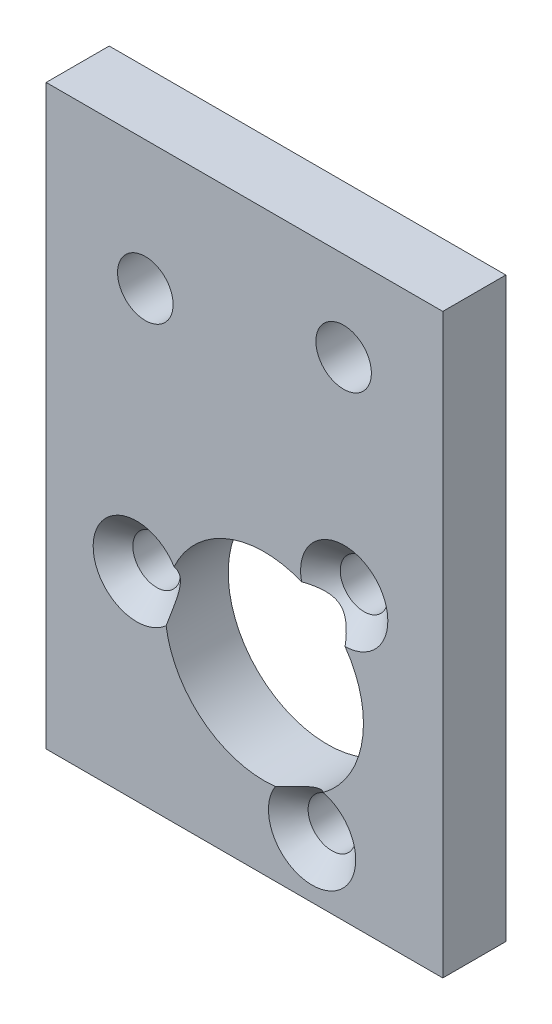
ISO-10303-21;
HEADER;
FILE_DESCRIPTION(('STEP AP214'),'2;1');
FILE_NAME('part.step','',(''),(''),'','','');
FILE_SCHEMA(('AUTOMOTIVE_DESIGN { 1 0 10303 214 1 1 1 1 }'));
ENDSEC;
DATA;
#1=APPLICATION_CONTEXT('core data for automotive mechanical design processes');
#2=APPLICATION_PROTOCOL_DEFINITION('international standard','automotive_design',2000,#1);
#3=PRODUCT_CONTEXT('',#1,'mechanical');
#4=PRODUCT('Part','Part','',(#3));
#5=PRODUCT_RELATED_PRODUCT_CATEGORY('part','',(#4));
#6=PRODUCT_DEFINITION_FORMATION('','',#4);
#7=PRODUCT_DEFINITION_CONTEXT('part definition',#1,'design');
#8=PRODUCT_DEFINITION('design','',#6,#7);
#9=PRODUCT_DEFINITION_SHAPE('','',#8);
#10=(LENGTH_UNIT() NAMED_UNIT(*) SI_UNIT(.MILLI.,.METRE.));
#11=(NAMED_UNIT(*) PLANE_ANGLE_UNIT() SI_UNIT($,.RADIAN.));
#12=(NAMED_UNIT(*) SI_UNIT($,.STERADIAN.) SOLID_ANGLE_UNIT());
#13=UNCERTAINTY_MEASURE_WITH_UNIT(LENGTH_MEASURE(1.E-05),#10,'distance_accuracy_value','');
#14=(GEOMETRIC_REPRESENTATION_CONTEXT(3) GLOBAL_UNCERTAINTY_ASSIGNED_CONTEXT((#13)) GLOBAL_UNIT_ASSIGNED_CONTEXT((#10,
#11,#12)) REPRESENTATION_CONTEXT('',''));
#15=CARTESIAN_POINT('',(0.,0.,0.));
#16=DIRECTION('',(0.,0.,1.));
#17=DIRECTION('',(1.,0.,0.));
#18=AXIS2_PLACEMENT_3D('',#15,#16,#17);
#19=CARTESIAN_POINT('',(0.,29.11,-3.18));
#20=DIRECTION('',(0.,-1.,0.));
#21=DIRECTION('',(0.,0.,-1.));
#22=AXIS2_PLACEMENT_3D('',#19,#20,#21);
#23=PLANE('',#22);
#24=DIRECTION('',(1.,0.,0.));
#25=VECTOR('',#24,1.);
#26=CARTESIAN_POINT('',(0.,29.11,0.));
#27=LINE('',#26,#25);
#28=CARTESIAN_POINT('',(0.,29.11,0.));
#29=VERTEX_POINT('',#28);
#30=CARTESIAN_POINT('',(20.,29.11,0.));
#31=VERTEX_POINT('',#30);
#32=EDGE_CURVE('E249',#29,#31,#27,.T.);
#33=ORIENTED_EDGE('',*,*,#32,.T.);
#34=DIRECTION('',(0.,0.,1.));
#35=VECTOR('',#34,1.);
#36=CARTESIAN_POINT('',(20.,29.11,-3.18));
#37=LINE('',#36,#35);
#38=CARTESIAN_POINT('',(20.,29.11,-3.18));
#39=VERTEX_POINT('',#38);
#40=EDGE_CURVE('E291',#39,#31,#37,.T.);
#41=ORIENTED_EDGE('',*,*,#40,.F.);
#42=DIRECTION('',(1.,0.,0.));
#43=VECTOR('',#42,1.);
#44=CARTESIAN_POINT('',(0.,29.11,-3.18));
#45=LINE('',#44,#43);
#46=CARTESIAN_POINT('',(0.,29.11,-3.18));
#47=VERTEX_POINT('',#46);
#48=EDGE_CURVE('E253',#47,#39,#45,.T.);
#49=ORIENTED_EDGE('',*,*,#48,.F.);
#50=DIRECTION('',(0.,0.,1.));
#51=VECTOR('',#50,1.);
#52=CARTESIAN_POINT('',(0.,29.11,-3.18));
#53=LINE('',#52,#51);
#54=EDGE_CURVE('E268',#47,#29,#53,.T.);
#55=ORIENTED_EDGE('',*,*,#54,.T.);
#56=EDGE_LOOP('',(#33,#41,#49,#55));
#57=FACE_BOUND('',#56,.T.);
#58=ADVANCED_FACE('F145',(#57),#23,.F.);
#59=CARTESIAN_POINT('',(20.,0.,-3.18));
#60=DIRECTION('',(1.,0.,0.));
#61=DIRECTION('',(0.,1.,0.));
#62=AXIS2_PLACEMENT_3D('',#59,#60,#61);
#63=PLANE('',#62);
#64=DIRECTION('',(0.,1.,0.));
#65=VECTOR('',#64,1.);
#66=CARTESIAN_POINT('',(20.,0.,0.));
#67=LINE('',#66,#65);
#68=CARTESIAN_POINT('',(20.,0.,0.));
#69=VERTEX_POINT('',#68);
#70=EDGE_CURVE('E272',#69,#31,#67,.T.);
#71=ORIENTED_EDGE('',*,*,#70,.F.);
#72=DIRECTION('',(0.,0.,1.));
#73=VECTOR('',#72,1.);
#74=CARTESIAN_POINT('',(20.,0.,-3.18));
#75=LINE('',#74,#73);
#76=CARTESIAN_POINT('',(20.,0.,-3.18));
#77=VERTEX_POINT('',#76);
#78=EDGE_CURVE('E288',#77,#69,#75,.T.);
#79=ORIENTED_EDGE('',*,*,#78,.F.);
#80=DIRECTION('',(0.,1.,0.));
#81=VECTOR('',#80,1.);
#82=CARTESIAN_POINT('',(20.,0.,-3.18));
#83=LINE('',#82,#81);
#84=EDGE_CURVE('E256',#77,#39,#83,.T.);
#85=ORIENTED_EDGE('',*,*,#84,.T.);
#86=ORIENTED_EDGE('',*,*,#40,.T.);
#87=EDGE_LOOP('',(#71,#79,#85,#86));
#88=FACE_BOUND('',#87,.T.);
#89=ADVANCED_FACE('F331',(#88),#63,.T.);
#90=CARTESIAN_POINT('',(0.,0.,-3.18));
#91=DIRECTION('',(0.,-1.,0.));
#92=DIRECTION('',(0.,0.,-1.));
#93=AXIS2_PLACEMENT_3D('',#90,#91,#92);
#94=PLANE('',#93);
#95=DIRECTION('',(1.,0.,0.));
#96=VECTOR('',#95,1.);
#97=CARTESIAN_POINT('',(0.,0.,0.));
#98=LINE('',#97,#96);
#99=CARTESIAN_POINT('',(0.,0.,0.));
#100=VERTEX_POINT('',#99);
#101=EDGE_CURVE('E276',#100,#69,#98,.T.);
#102=ORIENTED_EDGE('',*,*,#101,.F.);
#103=DIRECTION('',(0.,0.,1.));
#104=VECTOR('',#103,1.);
#105=CARTESIAN_POINT('',(0.,0.,-3.18));
#106=LINE('',#105,#104);
#107=CARTESIAN_POINT('',(0.,0.,-3.18));
#108=VERTEX_POINT('',#107);
#109=EDGE_CURVE('E285',#108,#100,#106,.T.);
#110=ORIENTED_EDGE('',*,*,#109,.F.);
#111=DIRECTION('',(1.,0.,0.));
#112=VECTOR('',#111,1.);
#113=CARTESIAN_POINT('',(0.,0.,-3.18));
#114=LINE('',#113,#112);
#115=EDGE_CURVE('E261',#108,#77,#114,.T.);
#116=ORIENTED_EDGE('',*,*,#115,.T.);
#117=ORIENTED_EDGE('',*,*,#78,.T.);
#118=EDGE_LOOP('',(#102,#110,#116,#117));
#119=FACE_BOUND('',#118,.T.);
#120=ADVANCED_FACE('F336',(#119),#94,.T.);
#121=CARTESIAN_POINT('',(0.,0.,-3.18));
#122=DIRECTION('',(1.,0.,0.));
#123=DIRECTION('',(0.,1.,0.));
#124=AXIS2_PLACEMENT_3D('',#121,#122,#123);
#125=PLANE('',#124);
#126=DIRECTION('',(0.,1.,0.));
#127=VECTOR('',#126,1.);
#128=CARTESIAN_POINT('',(0.,0.,0.));
#129=LINE('',#128,#127);
#130=EDGE_CURVE('E257',#100,#29,#129,.T.);
#131=ORIENTED_EDGE('',*,*,#130,.T.);
#132=ORIENTED_EDGE('',*,*,#54,.F.);
#133=DIRECTION('',(0.,1.,0.));
#134=VECTOR('',#133,1.);
#135=CARTESIAN_POINT('',(0.,0.,-3.18));
#136=LINE('',#135,#134);
#137=EDGE_CURVE('E265',#108,#47,#136,.T.);
#138=ORIENTED_EDGE('',*,*,#137,.F.);
#139=ORIENTED_EDGE('',*,*,#109,.T.);
#140=EDGE_LOOP('',(#131,#132,#138,#139));
#141=FACE_BOUND('',#140,.T.);
#142=ADVANCED_FACE('F353',(#141),#125,.F.);
#143=CARTESIAN_POINT('',(0.,0.,-3.18));
#144=DIRECTION('',(0.,0.,1.));
#145=DIRECTION('',(1.,0.,0.));
#146=AXIS2_PLACEMENT_3D('',#143,#144,#145);
#147=PLANE('',#146);
#148=CARTESIAN_POINT('',(13.41,2.96,-3.18));
#149=DIRECTION('',(0.,0.,1.));
#150=DIRECTION('',(1.,0.,0.));
#151=AXIS2_PLACEMENT_3D('',#148,#149,#150);
#152=CIRCLE('',#151,1.2);
#153=CARTESIAN_POINT('',(14.61,2.96,-3.18));
#154=VERTEX_POINT('',#153);
#155=EDGE_CURVE('E406',#154,#154,#152,.T.);
#156=ORIENTED_EDGE('',*,*,#155,.T.);
#157=EDGE_LOOP('',(#156));
#158=FACE_BOUND('',#157,.T.);
#159=CARTESIAN_POINT('',(4.57,10.04,-3.18));
#160=DIRECTION('',(0.,0.,1.));
#161=DIRECTION('',(1.,0.,0.));
#162=AXIS2_PLACEMENT_3D('',#159,#160,#161);
#163=CIRCLE('',#162,1.2);
#164=CARTESIAN_POINT('',(5.77,10.04,-3.18));
#165=VERTEX_POINT('',#164);
#166=EDGE_CURVE('E228',#165,#165,#163,.T.);
#167=ORIENTED_EDGE('',*,*,#166,.T.);
#168=EDGE_LOOP('',(#167));
#169=FACE_BOUND('',#168,.T.);
#170=CARTESIAN_POINT('',(11.,9.11,-3.18));
#171=DIRECTION('',(0.,0.,1.));
#172=DIRECTION('',(1.,0.,0.));
#173=AXIS2_PLACEMENT_3D('',#170,#171,#172);
#174=CIRCLE('',#173,5.);
#175=CARTESIAN_POINT('',(16.,9.11,-3.18));
#176=VERTEX_POINT('',#175);
#177=EDGE_CURVE('E227',#176,#176,#174,.T.);
#178=ORIENTED_EDGE('',*,*,#177,.T.);
#179=EDGE_LOOP('',(#178));
#180=FACE_BOUND('',#179,.T.);
#181=CARTESIAN_POINT('',(15.03,14.21,-3.18));
#182=DIRECTION('',(0.,0.,1.));
#183=DIRECTION('',(1.,0.,0.));
#184=AXIS2_PLACEMENT_3D('',#181,#182,#183);
#185=CIRCLE('',#184,1.2);
#186=CARTESIAN_POINT('',(16.23,14.21,-3.18));
#187=VERTEX_POINT('',#186);
#188=EDGE_CURVE('E232',#187,#187,#185,.T.);
#189=ORIENTED_EDGE('',*,*,#188,.T.);
#190=EDGE_LOOP('',(#189));
#191=FACE_BOUND('',#190,.T.);
#192=CARTESIAN_POINT('',(15.,24.61,-3.18));
#193=DIRECTION('',(0.,0.,1.));
#194=DIRECTION('',(1.,0.,0.));
#195=AXIS2_PLACEMENT_3D('',#192,#193,#194);
#196=CIRCLE('',#195,1.4);
#197=CARTESIAN_POINT('',(16.4,24.61,-3.18));
#198=VERTEX_POINT('',#197);
#199=EDGE_CURVE('E237',#198,#198,#196,.T.);
#200=ORIENTED_EDGE('',*,*,#199,.T.);
#201=EDGE_LOOP('',(#200));
#202=FACE_BOUND('',#201,.T.);
#203=CARTESIAN_POINT('',(5.,22.61,-3.18));
#204=DIRECTION('',(0.,0.,1.));
#205=DIRECTION('',(1.,0.,0.));
#206=AXIS2_PLACEMENT_3D('',#203,#204,#205);
#207=CIRCLE('',#206,1.4);
#208=CARTESIAN_POINT('',(6.4,22.61,-3.18));
#209=VERTEX_POINT('',#208);
#210=EDGE_CURVE('E245',#209,#209,#207,.T.);
#211=ORIENTED_EDGE('',*,*,#210,.T.);
#212=EDGE_LOOP('',(#211));
#213=FACE_BOUND('',#212,.T.);
#214=ORIENTED_EDGE('',*,*,#48,.T.);
#215=ORIENTED_EDGE('',*,*,#84,.F.);
#216=ORIENTED_EDGE('',*,*,#115,.F.);
#217=ORIENTED_EDGE('',*,*,#137,.T.);
#218=EDGE_LOOP('',(#214,#215,#216,#217));
#219=FACE_BOUND('',#218,.T.);
#220=ADVANCED_FACE('F349',(#158,#169,#180,#191,#202,#213,#219),#147,.F.);
#221=CARTESIAN_POINT('',(0.,0.,0.));
#222=DIRECTION('',(0.,0.,1.));
#223=DIRECTION('',(1.,0.,0.));
#224=AXIS2_PLACEMENT_3D('',#221,#222,#223);
#225=PLANE('',#224);
#226=CARTESIAN_POINT('',(4.57,10.04,0.));
#227=DIRECTION('',(0.,0.,1.));
#228=DIRECTION('',(1.,0.,0.));
#229=AXIS2_PLACEMENT_3D('',#226,#227,#228);
#230=CIRCLE('',#229,2.2);
#231=CARTESIAN_POINT('',(6.44989253134644,11.1828053511372,0.));
#232=VERTEX_POINT('',#231);
#233=CARTESIAN_POINT('',(6.04904814119879,8.41137585796588,0.));
#234=VERTEX_POINT('',#233);
#235=EDGE_CURVE('E165',#232,#234,#230,.T.);
#236=ORIENTED_EDGE('',*,*,#235,.F.);
#237=CARTESIAN_POINT('',(11.,9.11,0.));
#238=DIRECTION('',(0.,0.,1.));
#239=DIRECTION('',(1.,0.,0.));
#240=AXIS2_PLACEMENT_3D('',#237,#238,#239);
#241=CIRCLE('',#240,5.);
#242=CARTESIAN_POINT('',(12.8801268025838,13.7430468599191,0.));
#243=VERTEX_POINT('',#242);
#244=EDGE_CURVE('E214',#243,#232,#241,.T.);
#245=ORIENTED_EDGE('',*,*,#244,.F.);
#246=CARTESIAN_POINT('',(15.03,14.21,0.));
#247=DIRECTION('',(0.,0.,1.));
#248=DIRECTION('',(1.,0.,0.));
#249=AXIS2_PLACEMENT_3D('',#246,#247,#248);
#250=CIRCLE('',#249,2.2);
#251=CARTESIAN_POINT('',(15.0727860821122,12.0104160958996,0.));
#252=VERTEX_POINT('',#251);
#253=EDGE_CURVE('E171',#252,#243,#250,.T.);
#254=ORIENTED_EDGE('',*,*,#253,.F.);
#255=CARTESIAN_POINT('',(13.9698591974188,5.08757083996411,0.));
#256=VERTEX_POINT('',#255);
#257=EDGE_CURVE('E223',#256,#252,#241,.T.);
#258=ORIENTED_EDGE('',*,*,#257,.F.);
#259=CARTESIAN_POINT('',(13.41,2.96,0.));
#260=DIRECTION('',(0.,0.,1.));
#261=DIRECTION('',(1.,0.,0.));
#262=AXIS2_PLACEMENT_3D('',#259,#260,#261);
#263=CIRCLE('',#262,2.2);
#264=CARTESIAN_POINT('',(11.5537078862335,4.140753822085,0.));
#265=VERTEX_POINT('',#264);
#266=EDGE_CURVE('E394',#265,#256,#263,.T.);
#267=ORIENTED_EDGE('',*,*,#266,.F.);
#268=EDGE_CURVE('E216',#234,#265,#241,.T.);
#269=ORIENTED_EDGE('',*,*,#268,.F.);
#270=EDGE_LOOP('',(#236,#245,#254,#258,#267,#269));
#271=FACE_BOUND('',#270,.T.);
#272=CARTESIAN_POINT('',(15.,24.61,0.));
#273=DIRECTION('',(0.,0.,1.));
#274=DIRECTION('',(1.,0.,0.));
#275=AXIS2_PLACEMENT_3D('',#272,#273,#274);
#276=CIRCLE('',#275,1.4);
#277=CARTESIAN_POINT('',(16.4,24.61,0.));
#278=VERTEX_POINT('',#277);
#279=EDGE_CURVE('E236',#278,#278,#276,.T.);
#280=ORIENTED_EDGE('',*,*,#279,.F.);
#281=EDGE_LOOP('',(#280));
#282=FACE_BOUND('',#281,.T.);
#283=CARTESIAN_POINT('',(5.,22.61,0.));
#284=DIRECTION('',(0.,0.,1.));
#285=DIRECTION('',(1.,0.,0.));
#286=AXIS2_PLACEMENT_3D('',#283,#284,#285);
#287=CIRCLE('',#286,1.4);
#288=CARTESIAN_POINT('',(6.4,22.61,0.));
#289=VERTEX_POINT('',#288);
#290=EDGE_CURVE('E241',#289,#289,#287,.T.);
#291=ORIENTED_EDGE('',*,*,#290,.F.);
#292=EDGE_LOOP('',(#291));
#293=FACE_BOUND('',#292,.T.);
#294=ORIENTED_EDGE('',*,*,#32,.F.);
#295=ORIENTED_EDGE('',*,*,#130,.F.);
#296=ORIENTED_EDGE('',*,*,#101,.T.);
#297=ORIENTED_EDGE('',*,*,#70,.T.);
#298=EDGE_LOOP('',(#294,#295,#296,#297));
#299=FACE_BOUND('',#298,.T.);
#300=ADVANCED_FACE('F212',(#271,#282,#293,#299),#225,.T.);
#301=CARTESIAN_POINT('',(5.,22.61,-3.18));
#302=DIRECTION('',(0.,0.,1.));
#303=DIRECTION('',(1.,0.,0.));
#304=AXIS2_PLACEMENT_3D('',#301,#302,#303);
#305=CYLINDRICAL_SURFACE('',#304,1.4);
#306=CARTESIAN_POINT('',(6.4,22.61,-3.18));
#307=CARTESIAN_POINT('',(6.4,22.61,-3.146875));
#308=CARTESIAN_POINT('',(6.4,22.61,-3.11375));
#309=CARTESIAN_POINT('',(6.4,22.61,-3.0475));
#310=CARTESIAN_POINT('',(6.4,22.61,-3.014375));
#311=CARTESIAN_POINT('',(6.4,22.61,-2.948125));
#312=CARTESIAN_POINT('',(6.4,22.61,-2.915));
#313=CARTESIAN_POINT('',(6.4,22.61,-2.84875));
#314=CARTESIAN_POINT('',(6.4,22.61,-2.815625));
#315=CARTESIAN_POINT('',(6.4,22.61,-2.749375));
#316=CARTESIAN_POINT('',(6.4,22.61,-2.71625));
#317=CARTESIAN_POINT('',(6.4,22.61,-2.65));
#318=CARTESIAN_POINT('',(6.4,22.61,-2.616875));
#319=CARTESIAN_POINT('',(6.4,22.61,-2.550625));
#320=CARTESIAN_POINT('',(6.4,22.61,-2.5175));
#321=CARTESIAN_POINT('',(6.4,22.61,-2.45125));
#322=CARTESIAN_POINT('',(6.4,22.61,-2.418125));
#323=CARTESIAN_POINT('',(6.4,22.61,-2.351875));
#324=CARTESIAN_POINT('',(6.4,22.61,-2.31875));
#325=CARTESIAN_POINT('',(6.4,22.61,-2.2525));
#326=CARTESIAN_POINT('',(6.4,22.61,-2.219375));
#327=CARTESIAN_POINT('',(6.4,22.61,-2.153125));
#328=CARTESIAN_POINT('',(6.4,22.61,-2.12));
#329=CARTESIAN_POINT('',(6.4,22.61,-2.05375));
#330=CARTESIAN_POINT('',(6.4,22.61,-2.020625));
#331=CARTESIAN_POINT('',(6.4,22.61,-1.954375));
#332=CARTESIAN_POINT('',(6.4,22.61,-1.92125));
#333=CARTESIAN_POINT('',(6.4,22.61,-1.855));
#334=CARTESIAN_POINT('',(6.4,22.61,-1.821875));
#335=CARTESIAN_POINT('',(6.4,22.61,-1.755625));
#336=CARTESIAN_POINT('',(6.4,22.61,-1.7225));
#337=CARTESIAN_POINT('',(6.4,22.61,-1.65625));
#338=CARTESIAN_POINT('',(6.4,22.61,-1.623125));
#339=CARTESIAN_POINT('',(6.4,22.61,-1.556875));
#340=CARTESIAN_POINT('',(6.4,22.61,-1.52375));
#341=CARTESIAN_POINT('',(6.4,22.61,-1.4575));
#342=CARTESIAN_POINT('',(6.4,22.61,-1.424375));
#343=CARTESIAN_POINT('',(6.4,22.61,-1.358125));
#344=CARTESIAN_POINT('',(6.4,22.61,-1.325));
#345=CARTESIAN_POINT('',(6.4,22.61,-1.25875));
#346=CARTESIAN_POINT('',(6.4,22.61,-1.225625));
#347=CARTESIAN_POINT('',(6.4,22.61,-1.159375));
#348=CARTESIAN_POINT('',(6.4,22.61,-1.12625));
#349=CARTESIAN_POINT('',(6.4,22.61,-1.06));
#350=CARTESIAN_POINT('',(6.4,22.61,-1.026875));
#351=CARTESIAN_POINT('',(6.4,22.61,-0.960625));
#352=CARTESIAN_POINT('',(6.4,22.61,-0.9275));
#353=CARTESIAN_POINT('',(6.4,22.61,-0.86125));
#354=CARTESIAN_POINT('',(6.4,22.61,-0.828125));
#355=CARTESIAN_POINT('',(6.4,22.61,-0.761875));
#356=CARTESIAN_POINT('',(6.4,22.61,-0.72875));
#357=CARTESIAN_POINT('',(6.4,22.61,-0.6625));
#358=CARTESIAN_POINT('',(6.4,22.61,-0.629375));
#359=CARTESIAN_POINT('',(6.4,22.61,-0.563125));
#360=CARTESIAN_POINT('',(6.4,22.61,-0.53));
#361=CARTESIAN_POINT('',(6.4,22.61,-0.46375));
#362=CARTESIAN_POINT('',(6.4,22.61,-0.430625));
#363=CARTESIAN_POINT('',(6.4,22.61,-0.364375));
#364=CARTESIAN_POINT('',(6.4,22.61,-0.33125));
#365=CARTESIAN_POINT('',(6.4,22.61,-0.265));
#366=CARTESIAN_POINT('',(6.4,22.61,-0.231875));
#367=CARTESIAN_POINT('',(6.4,22.61,-0.165625));
#368=CARTESIAN_POINT('',(6.4,22.61,-0.1325));
#369=CARTESIAN_POINT('',(6.4,22.61,-0.06625));
#370=CARTESIAN_POINT('',(6.4,22.61,-0.033125));
#371=CARTESIAN_POINT('',(6.4,22.61,0.));
#372=B_SPLINE_CURVE_WITH_KNOTS('',3,(#306,#307,#308,#309,#310,#311,#312,#313,#314,#315,#316,
#317,#318,#319,#320,#321,#322,#323,#324,#325,#326,#327,#328,#329,#330,#331,#332,#333,#334,#335,
#336,#337,#338,#339,#340,#341,#342,#343,#344,#345,#346,#347,#348,#349,#350,#351,#352,#353,#354,
#355,#356,#357,#358,#359,#360,#361,#362,#363,#364,#365,#366,#367,#368,#369,#370,#371),
.UNSPECIFIED.,.F.,.F.,(4,2,2,2,2,2,2,2,2,2,2,2,2,2,2,2,2,2,2,2,2,2,2,2,2,2,2,2,2,2,2,2,4),(0.,
0.0993750000000001,0.19875,0.298125,0.3975,0.496875,0.59625,0.695625,0.795000000000001,0.894375,
0.99375,1.093125,1.1925,1.291875,1.39125,1.490625,1.59,1.689375,1.78875,1.888125,1.9875,
2.086875,2.18625,2.285625,2.385,2.484375,2.58375,2.683125,2.7825,2.881875,2.98125,3.080625,
3.18),.UNSPECIFIED.);
#373=EDGE_CURVE('BSEAM365',#209,#289,#372,.T.);
#374=ORIENTED_EDGE('',*,*,#210,.F.);
#375=ORIENTED_EDGE('',*,*,#290,.T.);
#376=ORIENTED_EDGE('',*,*,#373,.T.);
#377=ORIENTED_EDGE('',*,*,#373,.F.);
#378=EDGE_LOOP('',(#374,#376,#375,#377));
#379=FACE_BOUND('',#378,.T.);
#380=ADVANCED_FACE('F365',(#379),#305,.F.);
#381=CARTESIAN_POINT('',(15.,24.61,-3.18));
#382=DIRECTION('',(0.,0.,1.));
#383=DIRECTION('',(1.,0.,0.));
#384=AXIS2_PLACEMENT_3D('',#381,#382,#383);
#385=CYLINDRICAL_SURFACE('',#384,1.4);
#386=CARTESIAN_POINT('',(16.4,24.61,-3.18));
#387=CARTESIAN_POINT('',(16.4,24.61,-3.146875));
#388=CARTESIAN_POINT('',(16.4,24.61,-3.11375));
#389=CARTESIAN_POINT('',(16.4,24.61,-3.0475));
#390=CARTESIAN_POINT('',(16.4,24.61,-3.014375));
#391=CARTESIAN_POINT('',(16.4,24.61,-2.948125));
#392=CARTESIAN_POINT('',(16.4,24.61,-2.915));
#393=CARTESIAN_POINT('',(16.4,24.61,-2.84875));
#394=CARTESIAN_POINT('',(16.4,24.61,-2.815625));
#395=CARTESIAN_POINT('',(16.4,24.61,-2.749375));
#396=CARTESIAN_POINT('',(16.4,24.61,-2.71625));
#397=CARTESIAN_POINT('',(16.4,24.61,-2.65));
#398=CARTESIAN_POINT('',(16.4,24.61,-2.616875));
#399=CARTESIAN_POINT('',(16.4,24.61,-2.550625));
#400=CARTESIAN_POINT('',(16.4,24.61,-2.5175));
#401=CARTESIAN_POINT('',(16.4,24.61,-2.45125));
#402=CARTESIAN_POINT('',(16.4,24.61,-2.418125));
#403=CARTESIAN_POINT('',(16.4,24.61,-2.351875));
#404=CARTESIAN_POINT('',(16.4,24.61,-2.31875));
#405=CARTESIAN_POINT('',(16.4,24.61,-2.2525));
#406=CARTESIAN_POINT('',(16.4,24.61,-2.219375));
#407=CARTESIAN_POINT('',(16.4,24.61,-2.153125));
#408=CARTESIAN_POINT('',(16.4,24.61,-2.12));
#409=CARTESIAN_POINT('',(16.4,24.61,-2.05375));
#410=CARTESIAN_POINT('',(16.4,24.61,-2.020625));
#411=CARTESIAN_POINT('',(16.4,24.61,-1.954375));
#412=CARTESIAN_POINT('',(16.4,24.61,-1.92125));
#413=CARTESIAN_POINT('',(16.4,24.61,-1.855));
#414=CARTESIAN_POINT('',(16.4,24.61,-1.821875));
#415=CARTESIAN_POINT('',(16.4,24.61,-1.755625));
#416=CARTESIAN_POINT('',(16.4,24.61,-1.7225));
#417=CARTESIAN_POINT('',(16.4,24.61,-1.65625));
#418=CARTESIAN_POINT('',(16.4,24.61,-1.623125));
#419=CARTESIAN_POINT('',(16.4,24.61,-1.556875));
#420=CARTESIAN_POINT('',(16.4,24.61,-1.52375));
#421=CARTESIAN_POINT('',(16.4,24.61,-1.4575));
#422=CARTESIAN_POINT('',(16.4,24.61,-1.424375));
#423=CARTESIAN_POINT('',(16.4,24.61,-1.358125));
#424=CARTESIAN_POINT('',(16.4,24.61,-1.325));
#425=CARTESIAN_POINT('',(16.4,24.61,-1.25875));
#426=CARTESIAN_POINT('',(16.4,24.61,-1.225625));
#427=CARTESIAN_POINT('',(16.4,24.61,-1.159375));
#428=CARTESIAN_POINT('',(16.4,24.61,-1.12625));
#429=CARTESIAN_POINT('',(16.4,24.61,-1.06));
#430=CARTESIAN_POINT('',(16.4,24.61,-1.026875));
#431=CARTESIAN_POINT('',(16.4,24.61,-0.960625));
#432=CARTESIAN_POINT('',(16.4,24.61,-0.9275));
#433=CARTESIAN_POINT('',(16.4,24.61,-0.86125));
#434=CARTESIAN_POINT('',(16.4,24.61,-0.828125));
#435=CARTESIAN_POINT('',(16.4,24.61,-0.761875));
#436=CARTESIAN_POINT('',(16.4,24.61,-0.72875));
#437=CARTESIAN_POINT('',(16.4,24.61,-0.6625));
#438=CARTESIAN_POINT('',(16.4,24.61,-0.629375));
#439=CARTESIAN_POINT('',(16.4,24.61,-0.563125));
#440=CARTESIAN_POINT('',(16.4,24.61,-0.53));
#441=CARTESIAN_POINT('',(16.4,24.61,-0.46375));
#442=CARTESIAN_POINT('',(16.4,24.61,-0.430625));
#443=CARTESIAN_POINT('',(16.4,24.61,-0.364375));
#444=CARTESIAN_POINT('',(16.4,24.61,-0.33125));
#445=CARTESIAN_POINT('',(16.4,24.61,-0.265));
#446=CARTESIAN_POINT('',(16.4,24.61,-0.231875));
#447=CARTESIAN_POINT('',(16.4,24.61,-0.165625));
#448=CARTESIAN_POINT('',(16.4,24.61,-0.1325));
#449=CARTESIAN_POINT('',(16.4,24.61,-0.06625));
#450=CARTESIAN_POINT('',(16.4,24.61,-0.033125));
#451=CARTESIAN_POINT('',(16.4,24.61,0.));
#452=B_SPLINE_CURVE_WITH_KNOTS('',3,(#386,#387,#388,#389,#390,#391,#392,#393,#394,#395,#396,
#397,#398,#399,#400,#401,#402,#403,#404,#405,#406,#407,#408,#409,#410,#411,#412,#413,#414,#415,
#416,#417,#418,#419,#420,#421,#422,#423,#424,#425,#426,#427,#428,#429,#430,#431,#432,#433,#434,
#435,#436,#437,#438,#439,#440,#441,#442,#443,#444,#445,#446,#447,#448,#449,#450,#451),
.UNSPECIFIED.,.F.,.F.,(4,2,2,2,2,2,2,2,2,2,2,2,2,2,2,2,2,2,2,2,2,2,2,2,2,2,2,2,2,2,2,2,4),(0.,
0.0993750000000001,0.19875,0.298125,0.3975,0.496875,0.59625,0.695625,0.795000000000001,0.894375,
0.99375,1.093125,1.1925,1.291875,1.39125,1.490625,1.59,1.689375,1.78875,1.888125,1.9875,
2.086875,2.18625,2.285625,2.385,2.484375,2.58375,2.683125,2.7825,2.881875,2.98125,3.080625,
3.18),.UNSPECIFIED.);
#453=EDGE_CURVE('BSEAM369',#198,#278,#452,.T.);
#454=ORIENTED_EDGE('',*,*,#199,.F.);
#455=ORIENTED_EDGE('',*,*,#279,.T.);
#456=ORIENTED_EDGE('',*,*,#453,.T.);
#457=ORIENTED_EDGE('',*,*,#453,.F.);
#458=EDGE_LOOP('',(#454,#456,#455,#457));
#459=FACE_BOUND('',#458,.T.);
#460=ADVANCED_FACE('F369',(#459),#385,.F.);
#461=CARTESIAN_POINT('',(15.03,14.21,-3.18));
#462=DIRECTION('',(0.,0.,1.));
#463=DIRECTION('',(1.,0.,0.));
#464=AXIS2_PLACEMENT_3D('',#461,#462,#463);
#465=CYLINDRICAL_SURFACE('',#464,1.2);
#466=CARTESIAN_POINT('',(15.03,14.21,-1.));
#467=DIRECTION('',(0.,0.,1.));
#468=DIRECTION('',(1.,0.,0.));
#469=AXIS2_PLACEMENT_3D('',#466,#467,#468);
#470=CIRCLE('',#469,1.2);
#471=CARTESIAN_POINT('',(16.23,14.21,-1.));
#472=VERTEX_POINT('',#471);
#473=EDGE_CURVE('E380',#472,#472,#470,.T.);
#474=CARTESIAN_POINT('',(16.23,14.21,-1.));
#475=CARTESIAN_POINT('',(16.23,14.21,-1.02270833333333));
#476=CARTESIAN_POINT('',(16.23,14.21,-1.04541666666667));
#477=CARTESIAN_POINT('',(16.23,14.21,-1.09083333333333));
#478=CARTESIAN_POINT('',(16.23,14.21,-1.11354166666667));
#479=CARTESIAN_POINT('',(16.23,14.21,-1.15895833333333));
#480=CARTESIAN_POINT('',(16.23,14.21,-1.18166666666667));
#481=CARTESIAN_POINT('',(16.23,14.21,-1.22708333333333));
#482=CARTESIAN_POINT('',(16.23,14.21,-1.24979166666667));
#483=CARTESIAN_POINT('',(16.23,14.21,-1.29520833333333));
#484=CARTESIAN_POINT('',(16.23,14.21,-1.31791666666667));
#485=CARTESIAN_POINT('',(16.23,14.21,-1.36333333333333));
#486=CARTESIAN_POINT('',(16.23,14.21,-1.38604166666667));
#487=CARTESIAN_POINT('',(16.23,14.21,-1.43145833333333));
#488=CARTESIAN_POINT('',(16.23,14.21,-1.45416666666667));
#489=CARTESIAN_POINT('',(16.23,14.21,-1.49958333333333));
#490=CARTESIAN_POINT('',(16.23,14.21,-1.52229166666667));
#491=CARTESIAN_POINT('',(16.23,14.21,-1.56770833333333));
#492=CARTESIAN_POINT('',(16.23,14.21,-1.59041666666667));
#493=CARTESIAN_POINT('',(16.23,14.21,-1.63583333333333));
#494=CARTESIAN_POINT('',(16.23,14.21,-1.65854166666667));
#495=CARTESIAN_POINT('',(16.23,14.21,-1.70395833333333));
#496=CARTESIAN_POINT('',(16.23,14.21,-1.72666666666667));
#497=CARTESIAN_POINT('',(16.23,14.21,-1.77208333333333));
#498=CARTESIAN_POINT('',(16.23,14.21,-1.79479166666667));
#499=CARTESIAN_POINT('',(16.23,14.21,-1.84020833333333));
#500=CARTESIAN_POINT('',(16.23,14.21,-1.86291666666667));
#501=CARTESIAN_POINT('',(16.23,14.21,-1.90833333333333));
#502=CARTESIAN_POINT('',(16.23,14.21,-1.93104166666667));
#503=CARTESIAN_POINT('',(16.23,14.21,-1.97645833333333));
#504=CARTESIAN_POINT('',(16.23,14.21,-1.99916666666667));
#505=CARTESIAN_POINT('',(16.23,14.21,-2.04458333333333));
#506=CARTESIAN_POINT('',(16.23,14.21,-2.06729166666667));
#507=CARTESIAN_POINT('',(16.23,14.21,-2.11270833333333));
#508=CARTESIAN_POINT('',(16.23,14.21,-2.13541666666667));
#509=CARTESIAN_POINT('',(16.23,14.21,-2.18083333333333));
#510=CARTESIAN_POINT('',(16.23,14.21,-2.20354166666667));
#511=CARTESIAN_POINT('',(16.23,14.21,-2.24895833333333));
#512=CARTESIAN_POINT('',(16.23,14.21,-2.27166666666667));
#513=CARTESIAN_POINT('',(16.23,14.21,-2.31708333333333));
#514=CARTESIAN_POINT('',(16.23,14.21,-2.33979166666667));
#515=CARTESIAN_POINT('',(16.23,14.21,-2.38520833333333));
#516=CARTESIAN_POINT('',(16.23,14.21,-2.40791666666667));
#517=CARTESIAN_POINT('',(16.23,14.21,-2.45333333333333));
#518=CARTESIAN_POINT('',(16.23,14.21,-2.47604166666667));
#519=CARTESIAN_POINT('',(16.23,14.21,-2.52145833333333));
#520=CARTESIAN_POINT('',(16.23,14.21,-2.54416666666667));
#521=CARTESIAN_POINT('',(16.23,14.21,-2.58958333333333));
#522=CARTESIAN_POINT('',(16.23,14.21,-2.61229166666667));
#523=CARTESIAN_POINT('',(16.23,14.21,-2.65770833333333));
#524=CARTESIAN_POINT('',(16.23,14.21,-2.68041666666667));
#525=CARTESIAN_POINT('',(16.23,14.21,-2.72583333333333));
#526=CARTESIAN_POINT('',(16.23,14.21,-2.74854166666667));
#527=CARTESIAN_POINT('',(16.23,14.21,-2.79395833333333));
#528=CARTESIAN_POINT('',(16.23,14.21,-2.81666666666667));
#529=CARTESIAN_POINT('',(16.23,14.21,-2.86208333333333));
#530=CARTESIAN_POINT('',(16.23,14.21,-2.88479166666667));
#531=CARTESIAN_POINT('',(16.23,14.21,-2.93020833333333));
#532=CARTESIAN_POINT('',(16.23,14.21,-2.95291666666667));
#533=CARTESIAN_POINT('',(16.23,14.21,-2.99833333333333));
#534=CARTESIAN_POINT('',(16.23,14.21,-3.02104166666667));
#535=CARTESIAN_POINT('',(16.23,14.21,-3.06645833333333));
#536=CARTESIAN_POINT('',(16.23,14.21,-3.08916666666667));
#537=CARTESIAN_POINT('',(16.23,14.21,-3.13458333333333));
#538=CARTESIAN_POINT('',(16.23,14.21,-3.15729166666667));
#539=CARTESIAN_POINT('',(16.23,14.21,-3.18));
#540=B_SPLINE_CURVE_WITH_KNOTS('',3,(#474,#475,#476,#477,#478,#479,#480,#481,#482,#483,#484,
#485,#486,#487,#488,#489,#490,#491,#492,#493,#494,#495,#496,#497,#498,#499,#500,#501,#502,#503,
#504,#505,#506,#507,#508,#509,#510,#511,#512,#513,#514,#515,#516,#517,#518,#519,#520,#521,#522,
#523,#524,#525,#526,#527,#528,#529,#530,#531,#532,#533,#534,#535,#536,#537,#538,#539),
.UNSPECIFIED.,.F.,.F.,(4,2,2,2,2,2,2,2,2,2,2,2,2,2,2,2,2,2,2,2,2,2,2,2,2,2,2,2,2,2,2,2,4),(0.,
0.068125,0.13625,0.204375,0.2725,0.340625,0.40875,0.476875,0.545,0.613125,0.68125,0.749375,
0.8175,0.885625,0.95375,1.021875,1.09,1.158125,1.22625,1.294375,1.3625,1.430625,1.49875,
1.566875,1.635,1.703125,1.77125,1.839375,1.9075,1.975625,2.04375,2.111875,2.18),.UNSPECIFIED.);
#541=EDGE_CURVE('BSEAM326',#472,#187,#540,.T.);
#542=ORIENTED_EDGE('',*,*,#473,.T.);
#543=ORIENTED_EDGE('',*,*,#188,.F.);
#544=ORIENTED_EDGE('',*,*,#541,.T.);
#545=ORIENTED_EDGE('',*,*,#541,.F.);
#546=EDGE_LOOP('',(#542,#544,#543,#545));
#547=FACE_BOUND('',#546,.T.);
#548=ADVANCED_FACE('F326',(#547),#465,.F.);
#549=CARTESIAN_POINT('',(11.,9.11,-3.18));
#550=DIRECTION('',(0.,0.,1.));
#551=DIRECTION('',(1.,0.,0.));
#552=AXIS2_PLACEMENT_3D('',#549,#550,#551);
#553=CYLINDRICAL_SURFACE('',#552,5.);
#554=ORIENTED_EDGE('',*,*,#177,.F.);
#555=EDGE_LOOP('',(#554));
#556=FACE_BOUND('',#555,.T.);
#557=ORIENTED_EDGE('',*,*,#244,.T.);
#558=CARTESIAN_POINT('',(6.44999279460789,11.1830254293857,0.000200000000000067));
#559=CARTESIAN_POINT('',(6.4262805557591,11.1309540258408,-0.0470590584291178));
#560=CARTESIAN_POINT('',(6.40319944468995,11.077950637926,-0.0936605791873164));
#561=CARTESIAN_POINT('',(6.35824895027317,10.9694720603245,-0.184975561099125));
#562=CARTESIAN_POINT('',(6.33638452055183,10.9139882196502,-0.229681149208364));
#563=CARTESIAN_POINT('',(6.2933270599104,10.7985321246476,-0.317630396182856));
#564=CARTESIAN_POINT('',(6.27217721408638,10.7384733756709,-0.360782933002869));
#565=CARTESIAN_POINT('',(6.23143007297216,10.6149792648018,-0.442616502847765));
#566=CARTESIAN_POINT('',(6.21183031689291,10.5515495334387,-0.481304669853455));
#567=CARTESIAN_POINT('',(6.17448852588782,10.421110056908,-0.5518827304982));
#568=CARTESIAN_POINT('',(6.15673298061476,10.3541327230765,-0.583824146114088));
#569=CARTESIAN_POINT('',(6.12339766534845,10.2162162867274,-0.63799056376135));
#570=CARTESIAN_POINT('',(6.10780311005424,10.1453092841505,-0.66028406178654));
#571=CARTESIAN_POINT('',(6.08630181139236,10.0357421291082,-0.68414234154196));
#572=CARTESIAN_POINT('',(6.07939291789051,9.99830995118693,-0.690511400151569));
#573=CARTESIAN_POINT('',(6.06636786836683,9.92285715384418,-0.69953414977374));
#574=CARTESIAN_POINT('',(6.06025159528354,9.88483662224674,-0.702188389993504));
#575=CARTESIAN_POINT('',(6.0488975075873,9.80861800411544,-0.703606587946141));
#576=CARTESIAN_POINT('',(6.04365908263421,9.77042006008003,-0.702373260500027));
#577=CARTESIAN_POINT('',(6.03410057075906,9.69422708083937,-0.696111968489594));
#578=CARTESIAN_POINT('',(6.02978061602329,9.65623207560714,-0.691083458195622));
#579=CARTESIAN_POINT('',(6.0176269470098,9.53731056475185,-0.669670822178499));
#580=CARTESIAN_POINT('',(6.01147645072789,9.45733671543471,-0.646878314021687));
#581=CARTESIAN_POINT('',(6.00302333628004,9.30098226686128,-0.589328481557534));
#582=CARTESIAN_POINT('',(6.0007615192916,9.22464784346666,-0.554448847375059));
#583=CARTESIAN_POINT('',(5.99961401350849,9.08224493637019,-0.480194373129657));
#584=CARTESIAN_POINT('',(6.00046420154932,9.01584983788948,-0.441431161016591));
#585=CARTESIAN_POINT('',(6.00460287280752,8.88584869631099,-0.35945691864221));
#586=CARTESIAN_POINT('',(6.00789509714457,8.82224709127256,-0.316239151710955));
#587=CARTESIAN_POINT('',(6.0164999222494,8.69967678564632,-0.228441659666575));
#588=CARTESIAN_POINT('',(6.021733818767,8.64062372393115,-0.183970372990911));
#589=CARTESIAN_POINT('',(6.03405704681809,8.52452797196625,-0.0931451328535458));
#590=CARTESIAN_POINT('',(6.04113947792593,8.46747868198412,-0.0467987116567089));
#591=CARTESIAN_POINT('',(6.04908193820771,8.41113638997376,0.000200000000000329));
#592=B_SPLINE_CURVE_WITH_KNOTS('',3,(#558,#559,#560,#561,#562,#563,#564,#565,#566,#567,#568,
#569,#570,#571,#572,#573,#574,#575,#576,#577,#578,#579,#580,#581,#582,#583,#584,#585,#586,#587,
#588,#589,#590,#591),.UNSPECIFIED.,.F.,.F.,(4,2,2,2,2,2,2,2,2,2,2,2,2,2,2,2,4),(0.,
0.222668812778402,0.44618629796799,0.67678172486285,0.907003406477362,1.13539777096477,
1.36214291732958,1.47775762085643,1.59335522983628,1.70887213095454,1.82440564603177,
2.07299859375522,2.32418428637377,2.55456457267057,2.78529852484823,3.00755208010827,
3.22898756094934),.UNSPECIFIED.);
#593=EDGE_CURVE('E12',#232,#234,#592,.T.);
#594=ORIENTED_EDGE('',*,*,#593,.T.);
#595=ORIENTED_EDGE('',*,*,#268,.T.);
#596=CARTESIAN_POINT('',(11.5534527850428,4.14072540356961,0.00020000000000034));
#597=CARTESIAN_POINT('',(11.6053332713195,4.1465115629553,-0.040432674145812));
#598=CARTESIAN_POINT('',(11.65770591744,4.15315951395612,-0.0803641114523116));
#599=CARTESIAN_POINT('',(11.7638658521665,4.16839950378691,-0.158289972334144));
#600=CARTESIAN_POINT('',(11.8176573110645,4.17699801464591,-0.19627741937633));
#601=CARTESIAN_POINT('',(11.9282883052773,4.19659776079156,-0.270537915113941));
#602=CARTESIAN_POINT('',(11.9851710198978,4.20766030479481,-0.306731622476046));
#603=CARTESIAN_POINT('',(12.1007479335482,4.23231197915129,-0.375008101807815));
#604=CARTESIAN_POINT('',(12.1594395313749,4.24589761080628,-0.407096463731462));
#605=CARTESIAN_POINT('',(12.2873847158446,4.27806567490865,-0.469761913444488));
#606=CARTESIAN_POINT('',(12.3569595639826,4.29708277961624,-0.49948597067818));
#607=CARTESIAN_POINT('',(12.4981722028521,4.33916933220656,-0.548092303829218));
#608=CARTESIAN_POINT('',(12.5697888272745,4.3622048565615,-0.567060095858881));
#609=CARTESIAN_POINT('',(12.6784419223422,4.39997388820805,-0.585310510281853));
#610=CARTESIAN_POINT('',(12.7151669319731,4.41322028385234,-0.589686504264966));
#611=CARTESIAN_POINT('',(12.7885251729836,4.4406630377008,-0.594673929775574));
#612=CARTESIAN_POINT('',(12.8251584116354,4.45485931799324,-0.595285669674104));
#613=CARTESIAN_POINT('',(12.8979936141253,4.48407721903499,-0.592697319345482));
#614=CARTESIAN_POINT('',(12.9341951626342,4.49909956708312,-0.589493817084722));
#615=CARTESIAN_POINT('',(13.0058196341881,4.52980238069148,-0.579462191779765));
#616=CARTESIAN_POINT('',(13.0412420903133,4.54548322535645,-0.572631953685069));
#617=CARTESIAN_POINT('',(13.1581702495078,4.598857538966,-0.544231743373092));
#618=CARTESIAN_POINT('',(13.2373684468556,4.63770510627254,-0.515208437413981));
#619=CARTESIAN_POINT('',(13.3894810894987,4.7170670479732,-0.444593151611587));
#620=CARTESIAN_POINT('',(13.4623438251275,4.7575917566031,-0.402908333690337));
#621=CARTESIAN_POINT('',(13.5724677058084,4.82227648660265,-0.331040595382601));
#622=CARTESIAN_POINT('',(13.6117137143228,4.8460820408821,-0.303485031472342));
#623=CARTESIAN_POINT('',(13.6884698959292,4.89405630321997,-0.246315848974021));
#624=CARTESIAN_POINT('',(13.7259795258718,4.9182251218195,-0.216701593565809));
#625=CARTESIAN_POINT('',(13.7986837386041,4.96642266028695,-0.156515326033307));
#626=CARTESIAN_POINT('',(13.8339100332797,4.99044407676443,-0.125975440442787));
#627=CARTESIAN_POINT('',(13.9029780379372,5.03882242142118,-0.0637092701841942));
#628=CARTESIAN_POINT('',(13.9368211486448,5.06317897502229,-0.0319842513149867));
#629=CARTESIAN_POINT('',(13.9700656883131,5.08772330550154,0.000200000000000085));
#630=B_SPLINE_CURVE_WITH_KNOTS('',3,(#596,#597,#598,#599,#600,#601,#602,#603,#604,#605,#606,
#607,#608,#609,#610,#611,#612,#613,#614,#615,#616,#617,#618,#619,#620,#621,#622,#623,#624,#625,
#626,#627,#628,#629),.UNSPECIFIED.,.F.,.F.,(4,2,2,2,2,2,2,2,2,2,2,2,2,2,2,2,4),(0.,
0.198490168494709,0.397648825934123,0.602464271499343,0.806997797308174,1.04040911339508,
1.27193773015815,1.38962468948017,1.50730200765368,1.62508464565746,1.74293604805095,
2.01979752886518,2.29874016206519,2.45929153131415,2.6198927872266,2.77719823344036,
2.93434021893474),.UNSPECIFIED.);
#631=EDGE_CURVE('E294',#265,#256,#630,.T.);
#632=ORIENTED_EDGE('',*,*,#631,.T.);
#633=ORIENTED_EDGE('',*,*,#257,.T.);
#634=CARTESIAN_POINT('',(15.072926581641,12.0102187952915,0.000200000000000583));
#635=CARTESIAN_POINT('',(15.03988488617,12.0566024864895,-0.0467666342995632));
#636=CARTESIAN_POINT('',(15.0057287958626,12.1029100069813,-0.0930765819062073));
#637=CARTESIAN_POINT('',(14.9346941139729,12.1957151890997,-0.183814338401759));
#638=CARTESIAN_POINT('',(14.8978057714132,12.2422129111555,-0.228234418218001));
#639=CARTESIAN_POINT('',(14.8198503070527,12.3368584036043,-0.315610593550046));
#640=CARTESIAN_POINT('',(14.7786883167697,12.3850121233915,-0.358476865851182));
#641=CARTESIAN_POINT('',(14.6927023672302,12.4816653364645,-0.439778833229261));
#642=CARTESIAN_POINT('',(14.6478843542375,12.5301641556443,-0.478221486823428));
#643=CARTESIAN_POINT('',(14.5539233502898,12.6277004857652,-0.54864627115715));
#644=CARTESIAN_POINT('',(14.5047829603105,12.6767376574144,-0.580632249508533));
#645=CARTESIAN_POINT('',(14.4019701938905,12.7749123339561,-0.634861639832087));
#646=CARTESIAN_POINT('',(14.3483330742099,12.8240465621902,-0.657173680085642));
#647=CARTESIAN_POINT('',(14.2641470233013,12.8977140829214,-0.681034944936738));
#648=CARTESIAN_POINT('',(14.2351666014734,12.9225019497503,-0.687400698991645));
#649=CARTESIAN_POINT('',(14.176297532317,12.9716838482368,-0.69640834484153));
#650=CARTESIAN_POINT('',(14.1464090195577,12.9960779374354,-0.699050785667474));
#651=CARTESIAN_POINT('',(14.0860368067245,13.0441918166979,-0.700437542226875));
#652=CARTESIAN_POINT('',(14.0555535256888,13.0679120544998,-0.699184510467157));
#653=CARTESIAN_POINT('',(13.9943022188374,13.114452259676,-0.692877094453868));
#654=CARTESIAN_POINT('',(13.9635341525995,13.1372720967516,-0.687822162127894));
#655=CARTESIAN_POINT('',(13.8665284676663,13.2075208150398,-0.666314022152931));
#656=CARTESIAN_POINT('',(13.8002722885772,13.2530071692739,-0.643438492301864));
#657=CARTESIAN_POINT('',(13.668946512715,13.3388293991467,-0.585705714735939));
#658=CARTESIAN_POINT('',(13.6038963632442,13.3791069313164,-0.550726598125624));
#659=CARTESIAN_POINT('',(13.4815271120165,13.4512656630342,-0.476591483025761));
#660=CARTESIAN_POINT('',(13.4240433356236,13.4835774347229,-0.438105679991037));
#661=CARTESIAN_POINT('',(13.310250572684,13.5447402934608,-0.356745148071591));
#662=CARTESIAN_POINT('',(13.253943476237,13.5735861205408,-0.313863926906931));
#663=CARTESIAN_POINT('',(13.1442785006642,13.6272628519297,-0.22673902791536));
#664=CARTESIAN_POINT('',(13.0908878072848,13.6522015672092,-0.182601496000741));
#665=CARTESIAN_POINT('',(12.9849066801997,13.6994959495908,-0.092454464944237));
#666=CARTESIAN_POINT('',(12.9323140549134,13.7218606074376,-0.0464522905544751));
#667=CARTESIAN_POINT('',(12.8799023625661,13.7431379331095,0.000200000000001621));
#668=B_SPLINE_CURVE_WITH_KNOTS('',3,(#634,#635,#636,#637,#638,#639,#640,#641,#642,#643,#644,
#645,#646,#647,#648,#649,#650,#651,#652,#653,#654,#655,#656,#657,#658,#659,#660,#661,#662,#663,
#664,#665,#666,#667),.UNSPECIFIED.,.F.,.F.,(4,2,2,2,2,2,2,2,2,2,2,2,2,2,2,2,4),(0.,
0.221491678138027,0.44381591865807,0.673124155006586,0.902066602025647,1.13087221404243,
1.35802697546713,1.47384932777941,1.58965459941347,1.70538103414884,1.82112415491368,
2.0702358249413,2.32193248119689,2.55071430727544,2.77983906434135,3.00063714714583,
3.22063898089807),.UNSPECIFIED.);
#669=EDGE_CURVE('E159',#252,#243,#668,.T.);
#670=ORIENTED_EDGE('',*,*,#669,.T.);
#671=EDGE_LOOP('',(#557,#594,#595,#632,#633,#670));
#672=FACE_BOUND('',#671,.T.);
#673=ADVANCED_FACE('F220',(#556,#672),#553,.F.);
#674=CARTESIAN_POINT('',(4.57,10.04,-3.18));
#675=DIRECTION('',(0.,0.,1.));
#676=DIRECTION('',(1.,0.,0.));
#677=AXIS2_PLACEMENT_3D('',#674,#675,#676);
#678=CYLINDRICAL_SURFACE('',#677,1.2);
#679=CARTESIAN_POINT('',(4.57,10.04,-1.));
#680=DIRECTION('',(0.,0.,1.));
#681=DIRECTION('',(1.,0.,0.));
#682=AXIS2_PLACEMENT_3D('',#679,#680,#681);
#683=CIRCLE('',#682,1.2);
#684=CARTESIAN_POINT('',(5.77,10.04,-1.));
#685=VERTEX_POINT('',#684);
#686=EDGE_CURVE('E218',#685,#685,#683,.T.);
#687=CARTESIAN_POINT('',(5.77,10.04,-1.));
#688=CARTESIAN_POINT('',(5.77,10.04,-1.02270833333333));
#689=CARTESIAN_POINT('',(5.77,10.04,-1.04541666666667));
#690=CARTESIAN_POINT('',(5.77,10.04,-1.09083333333333));
#691=CARTESIAN_POINT('',(5.77,10.04,-1.11354166666667));
#692=CARTESIAN_POINT('',(5.77,10.04,-1.15895833333333));
#693=CARTESIAN_POINT('',(5.77,10.04,-1.18166666666667));
#694=CARTESIAN_POINT('',(5.77,10.04,-1.22708333333333));
#695=CARTESIAN_POINT('',(5.77,10.04,-1.24979166666667));
#696=CARTESIAN_POINT('',(5.77,10.04,-1.29520833333333));
#697=CARTESIAN_POINT('',(5.77,10.04,-1.31791666666667));
#698=CARTESIAN_POINT('',(5.77,10.04,-1.36333333333333));
#699=CARTESIAN_POINT('',(5.77,10.04,-1.38604166666667));
#700=CARTESIAN_POINT('',(5.77,10.04,-1.43145833333333));
#701=CARTESIAN_POINT('',(5.77,10.04,-1.45416666666667));
#702=CARTESIAN_POINT('',(5.77,10.04,-1.49958333333333));
#703=CARTESIAN_POINT('',(5.77,10.04,-1.52229166666667));
#704=CARTESIAN_POINT('',(5.77,10.04,-1.56770833333333));
#705=CARTESIAN_POINT('',(5.77,10.04,-1.59041666666667));
#706=CARTESIAN_POINT('',(5.77,10.04,-1.63583333333333));
#707=CARTESIAN_POINT('',(5.77,10.04,-1.65854166666667));
#708=CARTESIAN_POINT('',(5.77,10.04,-1.70395833333333));
#709=CARTESIAN_POINT('',(5.77,10.04,-1.72666666666667));
#710=CARTESIAN_POINT('',(5.77,10.04,-1.77208333333333));
#711=CARTESIAN_POINT('',(5.77,10.04,-1.79479166666667));
#712=CARTESIAN_POINT('',(5.77,10.04,-1.84020833333333));
#713=CARTESIAN_POINT('',(5.77,10.04,-1.86291666666667));
#714=CARTESIAN_POINT('',(5.77,10.04,-1.90833333333333));
#715=CARTESIAN_POINT('',(5.77,10.04,-1.93104166666667));
#716=CARTESIAN_POINT('',(5.77,10.04,-1.97645833333333));
#717=CARTESIAN_POINT('',(5.77,10.04,-1.99916666666667));
#718=CARTESIAN_POINT('',(5.77,10.04,-2.04458333333333));
#719=CARTESIAN_POINT('',(5.77,10.04,-2.06729166666667));
#720=CARTESIAN_POINT('',(5.77,10.04,-2.11270833333333));
#721=CARTESIAN_POINT('',(5.77,10.04,-2.13541666666667));
#722=CARTESIAN_POINT('',(5.77,10.04,-2.18083333333333));
#723=CARTESIAN_POINT('',(5.77,10.04,-2.20354166666667));
#724=CARTESIAN_POINT('',(5.77,10.04,-2.24895833333333));
#725=CARTESIAN_POINT('',(5.77,10.04,-2.27166666666667));
#726=CARTESIAN_POINT('',(5.77,10.04,-2.31708333333333));
#727=CARTESIAN_POINT('',(5.77,10.04,-2.33979166666667));
#728=CARTESIAN_POINT('',(5.77,10.04,-2.38520833333333));
#729=CARTESIAN_POINT('',(5.77,10.04,-2.40791666666667));
#730=CARTESIAN_POINT('',(5.77,10.04,-2.45333333333333));
#731=CARTESIAN_POINT('',(5.77,10.04,-2.47604166666667));
#732=CARTESIAN_POINT('',(5.77,10.04,-2.52145833333333));
#733=CARTESIAN_POINT('',(5.77,10.04,-2.54416666666667));
#734=CARTESIAN_POINT('',(5.77,10.04,-2.58958333333333));
#735=CARTESIAN_POINT('',(5.77,10.04,-2.61229166666667));
#736=CARTESIAN_POINT('',(5.77,10.04,-2.65770833333333));
#737=CARTESIAN_POINT('',(5.77,10.04,-2.68041666666667));
#738=CARTESIAN_POINT('',(5.77,10.04,-2.72583333333333));
#739=CARTESIAN_POINT('',(5.77,10.04,-2.74854166666667));
#740=CARTESIAN_POINT('',(5.77,10.04,-2.79395833333333));
#741=CARTESIAN_POINT('',(5.77,10.04,-2.81666666666667));
#742=CARTESIAN_POINT('',(5.77,10.04,-2.86208333333333));
#743=CARTESIAN_POINT('',(5.77,10.04,-2.88479166666667));
#744=CARTESIAN_POINT('',(5.77,10.04,-2.93020833333333));
#745=CARTESIAN_POINT('',(5.77,10.04,-2.95291666666667));
#746=CARTESIAN_POINT('',(5.77,10.04,-2.99833333333333));
#747=CARTESIAN_POINT('',(5.77,10.04,-3.02104166666667));
#748=CARTESIAN_POINT('',(5.77,10.04,-3.06645833333333));
#749=CARTESIAN_POINT('',(5.77,10.04,-3.08916666666667));
#750=CARTESIAN_POINT('',(5.77,10.04,-3.13458333333333));
#751=CARTESIAN_POINT('',(5.77,10.04,-3.15729166666667));
#752=CARTESIAN_POINT('',(5.77,10.04,-3.18));
#753=B_SPLINE_CURVE_WITH_KNOTS('',3,(#687,#688,#689,#690,#691,#692,#693,#694,#695,#696,#697,
#698,#699,#700,#701,#702,#703,#704,#705,#706,#707,#708,#709,#710,#711,#712,#713,#714,#715,#716,
#717,#718,#719,#720,#721,#722,#723,#724,#725,#726,#727,#728,#729,#730,#731,#732,#733,#734,#735,
#736,#737,#738,#739,#740,#741,#742,#743,#744,#745,#746,#747,#748,#749,#750,#751,#752),
.UNSPECIFIED.,.F.,.F.,(4,2,2,2,2,2,2,2,2,2,2,2,2,2,2,2,2,2,2,2,2,2,2,2,2,2,2,2,2,2,2,2,4),(0.,
0.068125,0.13625,0.204375,0.2725,0.340625,0.40875,0.476875,0.545,0.613125,0.68125,0.749375,
0.8175,0.885625,0.95375,1.021875,1.09,1.158125,1.22625,1.294375,1.3625,1.430625,1.49875,
1.566875,1.635,1.703125,1.77125,1.839375,1.9075,1.975625,2.04375,2.111875,2.18),.UNSPECIFIED.);
#754=EDGE_CURVE('BSEAM319',#685,#165,#753,.T.);
#755=ORIENTED_EDGE('',*,*,#686,.T.);
#756=ORIENTED_EDGE('',*,*,#166,.F.);
#757=ORIENTED_EDGE('',*,*,#754,.T.);
#758=ORIENTED_EDGE('',*,*,#754,.F.);
#759=EDGE_LOOP('',(#755,#757,#756,#758));
#760=FACE_BOUND('',#759,.T.);
#761=ADVANCED_FACE('F319',(#760),#678,.F.);
#762=CARTESIAN_POINT('',(13.41,2.96,-3.18));
#763=DIRECTION('',(0.,0.,1.));
#764=DIRECTION('',(1.,0.,0.));
#765=AXIS2_PLACEMENT_3D('',#762,#763,#764);
#766=CYLINDRICAL_SURFACE('',#765,1.2);
#767=CARTESIAN_POINT('',(13.41,2.96,-1.));
#768=DIRECTION('',(0.,0.,1.));
#769=DIRECTION('',(1.,0.,0.));
#770=AXIS2_PLACEMENT_3D('',#767,#768,#769);
#771=CIRCLE('',#770,1.2);
#772=CARTESIAN_POINT('',(14.61,2.96,-1.));
#773=VERTEX_POINT('',#772);
#774=EDGE_CURVE('E398',#773,#773,#771,.T.);
#775=CARTESIAN_POINT('',(14.61,2.96,-1.));
#776=CARTESIAN_POINT('',(14.61,2.96,-1.02270833333333));
#777=CARTESIAN_POINT('',(14.61,2.96,-1.04541666666667));
#778=CARTESIAN_POINT('',(14.61,2.96,-1.09083333333333));
#779=CARTESIAN_POINT('',(14.61,2.96,-1.11354166666667));
#780=CARTESIAN_POINT('',(14.61,2.96,-1.15895833333333));
#781=CARTESIAN_POINT('',(14.61,2.96,-1.18166666666667));
#782=CARTESIAN_POINT('',(14.61,2.96,-1.22708333333333));
#783=CARTESIAN_POINT('',(14.61,2.96,-1.24979166666667));
#784=CARTESIAN_POINT('',(14.61,2.96,-1.29520833333333));
#785=CARTESIAN_POINT('',(14.61,2.96,-1.31791666666667));
#786=CARTESIAN_POINT('',(14.61,2.96,-1.36333333333333));
#787=CARTESIAN_POINT('',(14.61,2.96,-1.38604166666667));
#788=CARTESIAN_POINT('',(14.61,2.96,-1.43145833333333));
#789=CARTESIAN_POINT('',(14.61,2.96,-1.45416666666667));
#790=CARTESIAN_POINT('',(14.61,2.96,-1.49958333333333));
#791=CARTESIAN_POINT('',(14.61,2.96,-1.52229166666667));
#792=CARTESIAN_POINT('',(14.61,2.96,-1.56770833333333));
#793=CARTESIAN_POINT('',(14.61,2.96,-1.59041666666667));
#794=CARTESIAN_POINT('',(14.61,2.96,-1.63583333333333));
#795=CARTESIAN_POINT('',(14.61,2.96,-1.65854166666667));
#796=CARTESIAN_POINT('',(14.61,2.96,-1.70395833333333));
#797=CARTESIAN_POINT('',(14.61,2.96,-1.72666666666667));
#798=CARTESIAN_POINT('',(14.61,2.96,-1.77208333333333));
#799=CARTESIAN_POINT('',(14.61,2.96,-1.79479166666667));
#800=CARTESIAN_POINT('',(14.61,2.96,-1.84020833333333));
#801=CARTESIAN_POINT('',(14.61,2.96,-1.86291666666667));
#802=CARTESIAN_POINT('',(14.61,2.96,-1.90833333333333));
#803=CARTESIAN_POINT('',(14.61,2.96,-1.93104166666667));
#804=CARTESIAN_POINT('',(14.61,2.96,-1.97645833333333));
#805=CARTESIAN_POINT('',(14.61,2.96,-1.99916666666667));
#806=CARTESIAN_POINT('',(14.61,2.96,-2.04458333333333));
#807=CARTESIAN_POINT('',(14.61,2.96,-2.06729166666667));
#808=CARTESIAN_POINT('',(14.61,2.96,-2.11270833333333));
#809=CARTESIAN_POINT('',(14.61,2.96,-2.13541666666667));
#810=CARTESIAN_POINT('',(14.61,2.96,-2.18083333333333));
#811=CARTESIAN_POINT('',(14.61,2.96,-2.20354166666667));
#812=CARTESIAN_POINT('',(14.61,2.96,-2.24895833333333));
#813=CARTESIAN_POINT('',(14.61,2.96,-2.27166666666667));
#814=CARTESIAN_POINT('',(14.61,2.96,-2.31708333333333));
#815=CARTESIAN_POINT('',(14.61,2.96,-2.33979166666667));
#816=CARTESIAN_POINT('',(14.61,2.96,-2.38520833333333));
#817=CARTESIAN_POINT('',(14.61,2.96,-2.40791666666667));
#818=CARTESIAN_POINT('',(14.61,2.96,-2.45333333333333));
#819=CARTESIAN_POINT('',(14.61,2.96,-2.47604166666667));
#820=CARTESIAN_POINT('',(14.61,2.96,-2.52145833333333));
#821=CARTESIAN_POINT('',(14.61,2.96,-2.54416666666667));
#822=CARTESIAN_POINT('',(14.61,2.96,-2.58958333333333));
#823=CARTESIAN_POINT('',(14.61,2.96,-2.61229166666667));
#824=CARTESIAN_POINT('',(14.61,2.96,-2.65770833333333));
#825=CARTESIAN_POINT('',(14.61,2.96,-2.68041666666667));
#826=CARTESIAN_POINT('',(14.61,2.96,-2.72583333333333));
#827=CARTESIAN_POINT('',(14.61,2.96,-2.74854166666667));
#828=CARTESIAN_POINT('',(14.61,2.96,-2.79395833333333));
#829=CARTESIAN_POINT('',(14.61,2.96,-2.81666666666667));
#830=CARTESIAN_POINT('',(14.61,2.96,-2.86208333333333));
#831=CARTESIAN_POINT('',(14.61,2.96,-2.88479166666667));
#832=CARTESIAN_POINT('',(14.61,2.96,-2.93020833333333));
#833=CARTESIAN_POINT('',(14.61,2.96,-2.95291666666667));
#834=CARTESIAN_POINT('',(14.61,2.96,-2.99833333333333));
#835=CARTESIAN_POINT('',(14.61,2.96,-3.02104166666667));
#836=CARTESIAN_POINT('',(14.61,2.96,-3.06645833333333));
#837=CARTESIAN_POINT('',(14.61,2.96,-3.08916666666667));
#838=CARTESIAN_POINT('',(14.61,2.96,-3.13458333333333));
#839=CARTESIAN_POINT('',(14.61,2.96,-3.15729166666667));
#840=CARTESIAN_POINT('',(14.61,2.96,-3.18));
#841=B_SPLINE_CURVE_WITH_KNOTS('',3,(#775,#776,#777,#778,#779,#780,#781,#782,#783,#784,#785,
#786,#787,#788,#789,#790,#791,#792,#793,#794,#795,#796,#797,#798,#799,#800,#801,#802,#803,#804,
#805,#806,#807,#808,#809,#810,#811,#812,#813,#814,#815,#816,#817,#818,#819,#820,#821,#822,#823,
#824,#825,#826,#827,#828,#829,#830,#831,#832,#833,#834,#835,#836,#837,#838,#839,#840),
.UNSPECIFIED.,.F.,.F.,(4,2,2,2,2,2,2,2,2,2,2,2,2,2,2,2,2,2,2,2,2,2,2,2,2,2,2,2,2,2,2,2,4),(0.,
0.068125,0.13625,0.204375,0.2725,0.340625,0.40875,0.476875,0.545,0.613125,0.68125,0.749375,
0.8175,0.885625,0.95375,1.021875,1.09,1.158125,1.22625,1.294375,1.3625,1.430625,1.49875,
1.566875,1.635,1.703125,1.77125,1.839375,1.9075,1.975625,2.04375,2.111875,2.18),.UNSPECIFIED.);
#842=EDGE_CURVE('BSEAM315',#773,#154,#841,.T.);
#843=ORIENTED_EDGE('',*,*,#774,.T.);
#844=ORIENTED_EDGE('',*,*,#155,.F.);
#845=ORIENTED_EDGE('',*,*,#842,.T.);
#846=ORIENTED_EDGE('',*,*,#842,.F.);
#847=EDGE_LOOP('',(#843,#845,#844,#846));
#848=FACE_BOUND('',#847,.T.);
#849=ADVANCED_FACE('F315',(#848),#766,.F.);
#850=CARTESIAN_POINT('',(13.41,2.96,0.));
#851=DIRECTION('',(0.,0.,1.));
#852=DIRECTION('',(1.,0.,0.));
#853=AXIS2_PLACEMENT_3D('',#850,#851,#852);
#854=CONICAL_SURFACE('',#853,2.2,0.785398163397448);
#855=ORIENTED_EDGE('',*,*,#774,.F.);
#856=EDGE_LOOP('',(#855));
#857=FACE_BOUND('',#856,.T.);
#858=ORIENTED_EDGE('',*,*,#266,.T.);
#859=ORIENTED_EDGE('',*,*,#631,.F.);
#860=EDGE_LOOP('',(#858,#859));
#861=FACE_BOUND('',#860,.T.);
#862=ADVANCED_FACE('F310',(#857,#861),#854,.F.);
#863=CARTESIAN_POINT('',(15.03,14.21,0.));
#864=DIRECTION('',(0.,0.,1.));
#865=DIRECTION('',(1.,0.,0.));
#866=AXIS2_PLACEMENT_3D('',#863,#864,#865);
#867=CONICAL_SURFACE('',#866,2.2,0.785398163397448);
#868=ORIENTED_EDGE('',*,*,#473,.F.);
#869=EDGE_LOOP('',(#868));
#870=FACE_BOUND('',#869,.T.);
#871=ORIENTED_EDGE('',*,*,#253,.T.);
#872=ORIENTED_EDGE('',*,*,#669,.F.);
#873=EDGE_LOOP('',(#871,#872));
#874=FACE_BOUND('',#873,.T.);
#875=ADVANCED_FACE('F314',(#870,#874),#867,.F.);
#876=CARTESIAN_POINT('',(4.57,10.04,0.));
#877=DIRECTION('',(0.,0.,1.));
#878=DIRECTION('',(1.,0.,0.));
#879=AXIS2_PLACEMENT_3D('',#876,#877,#878);
#880=CONICAL_SURFACE('',#879,2.2,0.785398163397448);
#881=ORIENTED_EDGE('',*,*,#686,.F.);
#882=EDGE_LOOP('',(#881));
#883=FACE_BOUND('',#882,.T.);
#884=ORIENTED_EDGE('',*,*,#235,.T.);
#885=ORIENTED_EDGE('',*,*,#593,.F.);
#886=EDGE_LOOP('',(#884,#885));
#887=FACE_BOUND('',#886,.T.);
#888=ADVANCED_FACE('F206',(#883,#887),#880,.F.);
#889=CLOSED_SHELL('',(#58,#89,#120,#142,#220,#300,#380,#460,#548,#673,#761,#849,#862,#875,#888));
#890=MANIFOLD_SOLID_BREP('B2',#889);
#891=ADVANCED_BREP_SHAPE_REPRESENTATION('',(#18,#890),#14);
#892=SHAPE_DEFINITION_REPRESENTATION(#9,#891);
ENDSEC;
END-ISO-10303-21;
